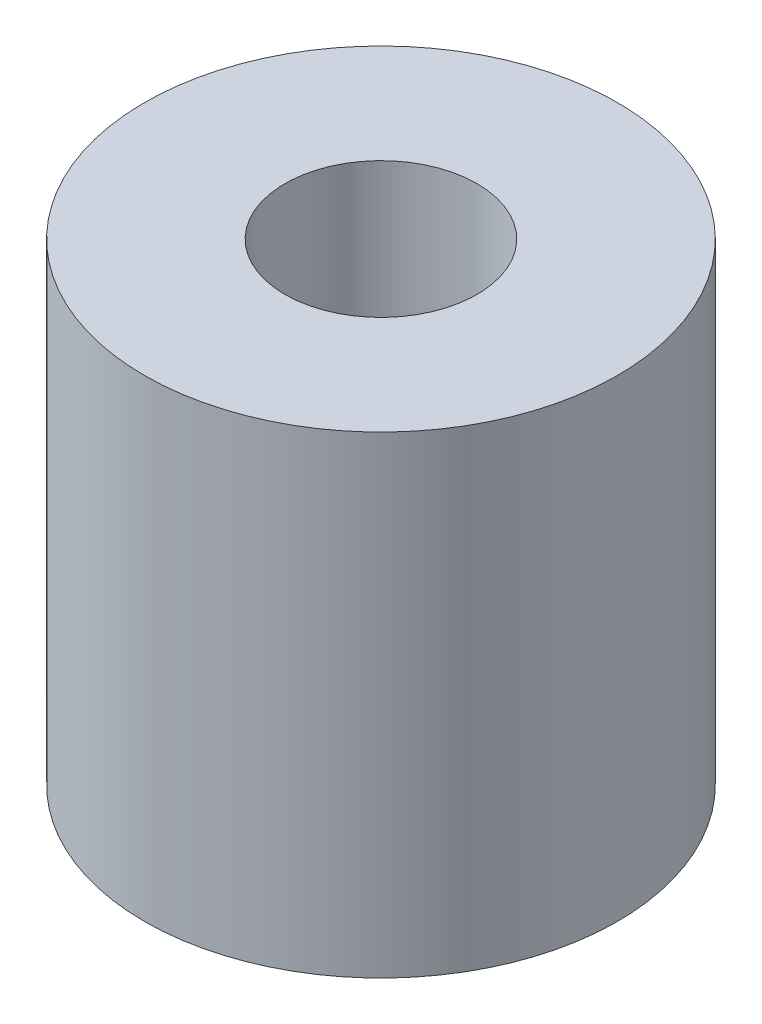
ISO-10303-21;
HEADER;
FILE_DESCRIPTION(('STEP AP214'),'2;1');
FILE_NAME('part.step','',(''),(''),'','','');
FILE_SCHEMA(('AUTOMOTIVE_DESIGN { 1 0 10303 214 1 1 1 1 }'));
ENDSEC;
DATA;
#1=APPLICATION_CONTEXT('core data for automotive mechanical design processes');
#2=APPLICATION_PROTOCOL_DEFINITION('international standard','automotive_design',2000,#1);
#3=PRODUCT_CONTEXT('',#1,'mechanical');
#4=PRODUCT('Part','Part','',(#3));
#5=PRODUCT_RELATED_PRODUCT_CATEGORY('part','',(#4));
#6=PRODUCT_DEFINITION_FORMATION('','',#4);
#7=PRODUCT_DEFINITION_CONTEXT('part definition',#1,'design');
#8=PRODUCT_DEFINITION('design','',#6,#7);
#9=PRODUCT_DEFINITION_SHAPE('','',#8);
#10=(LENGTH_UNIT() NAMED_UNIT(*) SI_UNIT(.MILLI.,.METRE.));
#11=(NAMED_UNIT(*) PLANE_ANGLE_UNIT() SI_UNIT($,.RADIAN.));
#12=(NAMED_UNIT(*) SI_UNIT($,.STERADIAN.) SOLID_ANGLE_UNIT());
#13=UNCERTAINTY_MEASURE_WITH_UNIT(LENGTH_MEASURE(1.E-05),#10,'distance_accuracy_value','');
#14=(GEOMETRIC_REPRESENTATION_CONTEXT(3) GLOBAL_UNCERTAINTY_ASSIGNED_CONTEXT((#13)) GLOBAL_UNIT_ASSIGNED_CONTEXT((#10,
#11,#12)) REPRESENTATION_CONTEXT('',''));
#15=CARTESIAN_POINT('',(0.,0.,0.));
#16=DIRECTION('',(0.,0.,1.));
#17=DIRECTION('',(1.,0.,0.));
#18=AXIS2_PLACEMENT_3D('',#15,#16,#17);
#19=CARTESIAN_POINT('',(0.,12.7,0.));
#20=DIRECTION('',(0.,1.,0.));
#21=DIRECTION('',(0.,0.,1.));
#22=AXIS2_PLACEMENT_3D('',#19,#20,#21);
#23=PLANE('',#22);
#24=CARTESIAN_POINT('',(0.,12.7,0.));
#25=DIRECTION('',(0.,1.,0.));
#26=DIRECTION('',(0.,0.,1.));
#27=AXIS2_PLACEMENT_3D('',#24,#25,#26);
#28=CIRCLE('',#27,6.35);
#29=CARTESIAN_POINT('',(0.,12.7,6.35));
#30=VERTEX_POINT('',#29);
#31=EDGE_CURVE('E10',#30,#30,#28,.T.);
#32=ORIENTED_EDGE('',*,*,#31,.T.);
#33=EDGE_LOOP('',(#32));
#34=FACE_BOUND('',#33,.T.);
#35=CARTESIAN_POINT('',(0.,12.7,0.));
#36=DIRECTION('',(0.,1.,0.));
#37=DIRECTION('',(0.,0.,1.));
#38=AXIS2_PLACEMENT_3D('',#35,#36,#37);
#39=CIRCLE('',#38,2.5796875);
#40=CARTESIAN_POINT('',(0.,12.7,2.5796875));
#41=VERTEX_POINT('',#40);
#42=EDGE_CURVE('E50',#41,#41,#39,.T.);
#43=ORIENTED_EDGE('',*,*,#42,.F.);
#44=EDGE_LOOP('',(#43));
#45=FACE_BOUND('',#44,.T.);
#46=ADVANCED_FACE('F37',(#34,#45),#23,.T.);
#47=CARTESIAN_POINT('',(0.,0.,0.));
#48=DIRECTION('',(0.,1.,0.));
#49=DIRECTION('',(0.,0.,1.));
#50=AXIS2_PLACEMENT_3D('',#47,#48,#49);
#51=PLANE('',#50);
#52=CARTESIAN_POINT('',(0.,0.,0.));
#53=DIRECTION('',(0.,1.,0.));
#54=DIRECTION('',(0.,0.,1.));
#55=AXIS2_PLACEMENT_3D('',#52,#53,#54);
#56=CIRCLE('',#55,6.35);
#57=CARTESIAN_POINT('',(0.,0.,6.35));
#58=VERTEX_POINT('',#57);
#59=EDGE_CURVE('E41',#58,#58,#56,.T.);
#60=ORIENTED_EDGE('',*,*,#59,.F.);
#61=EDGE_LOOP('',(#60));
#62=FACE_BOUND('',#61,.T.);
#63=CARTESIAN_POINT('',(0.,0.,0.));
#64=DIRECTION('',(0.,1.,0.));
#65=DIRECTION('',(0.,0.,1.));
#66=AXIS2_PLACEMENT_3D('',#63,#64,#65);
#67=CIRCLE('',#66,2.5796875);
#68=CARTESIAN_POINT('',(0.,0.,2.5796875));
#69=VERTEX_POINT('',#68);
#70=EDGE_CURVE('E52',#69,#69,#67,.T.);
#71=ORIENTED_EDGE('',*,*,#70,.T.);
#72=EDGE_LOOP('',(#71));
#73=FACE_BOUND('',#72,.T.);
#74=ADVANCED_FACE('F64',(#62,#73),#51,.F.);
#75=CARTESIAN_POINT('',(0.,12.7,0.));
#76=DIRECTION('',(0.,-1.,0.));
#77=DIRECTION('',(0.,0.,-1.));
#78=AXIS2_PLACEMENT_3D('',#75,#76,#77);
#79=CYLINDRICAL_SURFACE('',#78,6.35);
#80=ORIENTED_EDGE('',*,*,#31,.F.);
#81=EDGE_LOOP('',(#80));
#82=FACE_BOUND('',#81,.T.);
#83=ORIENTED_EDGE('',*,*,#59,.T.);
#84=EDGE_LOOP('',(#83));
#85=FACE_BOUND('',#84,.T.);
#86=ADVANCED_FACE('F39',(#82,#85),#79,.T.);
#87=CARTESIAN_POINT('',(0.,12.7,0.));
#88=DIRECTION('',(0.,-1.,0.));
#89=DIRECTION('',(0.,0.,-1.));
#90=AXIS2_PLACEMENT_3D('',#87,#88,#89);
#91=CYLINDRICAL_SURFACE('',#90,2.5796875);
#92=ORIENTED_EDGE('',*,*,#42,.T.);
#93=EDGE_LOOP('',(#92));
#94=FACE_BOUND('',#93,.T.);
#95=ORIENTED_EDGE('',*,*,#70,.F.);
#96=EDGE_LOOP('',(#95));
#97=FACE_BOUND('',#96,.T.);
#98=ADVANCED_FACE('F60',(#94,#97),#91,.F.);
#99=CLOSED_SHELL('',(#46,#74,#86,#98));
#100=MANIFOLD_SOLID_BREP('B2',#99);
#101=ADVANCED_BREP_SHAPE_REPRESENTATION('',(#18,#100),#14);
#102=SHAPE_DEFINITION_REPRESENTATION(#9,#101);
ENDSEC;
END-ISO-10303-21;
